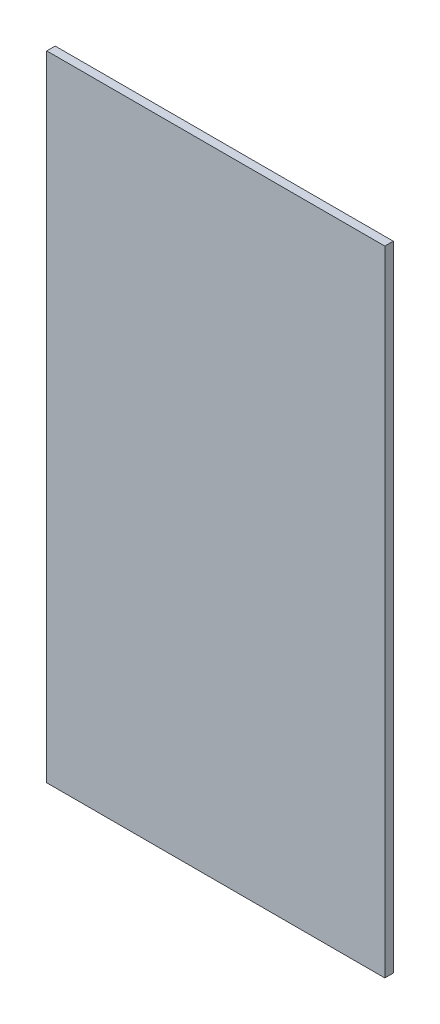
ISO-10303-21;
HEADER;
FILE_DESCRIPTION(('STEP AP214'),'2;1');
FILE_NAME('part.step','',(''),(''),'','','');
FILE_SCHEMA(('AUTOMOTIVE_DESIGN { 1 0 10303 214 1 1 1 1 }'));
ENDSEC;
DATA;
#1=APPLICATION_CONTEXT('core data for automotive mechanical design processes');
#2=APPLICATION_PROTOCOL_DEFINITION('international standard','automotive_design',2000,#1);
#3=PRODUCT_CONTEXT('',#1,'mechanical');
#4=PRODUCT('Part','Part','',(#3));
#5=PRODUCT_RELATED_PRODUCT_CATEGORY('part','',(#4));
#6=PRODUCT_DEFINITION_FORMATION('','',#4);
#7=PRODUCT_DEFINITION_CONTEXT('part definition',#1,'design');
#8=PRODUCT_DEFINITION('design','',#6,#7);
#9=PRODUCT_DEFINITION_SHAPE('','',#8);
#10=(LENGTH_UNIT() NAMED_UNIT(*) SI_UNIT(.MILLI.,.METRE.));
#11=(NAMED_UNIT(*) PLANE_ANGLE_UNIT() SI_UNIT($,.RADIAN.));
#12=(NAMED_UNIT(*) SI_UNIT($,.STERADIAN.) SOLID_ANGLE_UNIT());
#13=UNCERTAINTY_MEASURE_WITH_UNIT(LENGTH_MEASURE(1.E-05),#10,'distance_accuracy_value','');
#14=(GEOMETRIC_REPRESENTATION_CONTEXT(3) GLOBAL_UNCERTAINTY_ASSIGNED_CONTEXT((#13)) GLOBAL_UNIT_ASSIGNED_CONTEXT((#10,
#11,#12)) REPRESENTATION_CONTEXT('',''));
#15=CARTESIAN_POINT('',(0.,0.,0.));
#16=DIRECTION('',(0.,0.,1.));
#17=DIRECTION('',(1.,0.,0.));
#18=AXIS2_PLACEMENT_3D('',#15,#16,#17);
#19=CARTESIAN_POINT('',(0.,0.,10.));
#20=DIRECTION('',(1.,0.,0.));
#21=DIRECTION('',(0.,0.,-1.));
#22=AXIS2_PLACEMENT_3D('',#19,#20,#21);
#23=PLANE('',#22);
#24=DIRECTION('',(0.,-1.,0.));
#25=VECTOR('',#24,1.);
#26=CARTESIAN_POINT('',(0.,0.,0.));
#27=LINE('',#26,#25);
#28=CARTESIAN_POINT('',(0.,0.,0.));
#29=VERTEX_POINT('',#28);
#30=CARTESIAN_POINT('',(0.,-750.,0.));
#31=VERTEX_POINT('',#30);
#32=EDGE_CURVE('E110',#29,#31,#27,.T.);
#33=ORIENTED_EDGE('',*,*,#32,.T.);
#34=DIRECTION('',(0.,0.,-1.));
#35=VECTOR('',#34,1.);
#36=CARTESIAN_POINT('',(0.,-750.,10.));
#37=LINE('',#36,#35);
#38=CARTESIAN_POINT('',(0.,-750.,10.));
#39=VERTEX_POINT('',#38);
#40=EDGE_CURVE('E11',#39,#31,#37,.T.);
#41=ORIENTED_EDGE('',*,*,#40,.F.);
#42=DIRECTION('',(0.,-1.,0.));
#43=VECTOR('',#42,1.);
#44=CARTESIAN_POINT('',(0.,0.,10.));
#45=LINE('',#44,#43);
#46=CARTESIAN_POINT('',(0.,0.,10.));
#47=VERTEX_POINT('',#46);
#48=EDGE_CURVE('E94',#47,#39,#45,.T.);
#49=ORIENTED_EDGE('',*,*,#48,.F.);
#50=DIRECTION('',(0.,0.,-1.));
#51=VECTOR('',#50,1.);
#52=CARTESIAN_POINT('',(0.,0.,10.));
#53=LINE('',#52,#51);
#54=EDGE_CURVE('E106',#47,#29,#53,.T.);
#55=ORIENTED_EDGE('',*,*,#54,.T.);
#56=EDGE_LOOP('',(#33,#41,#49,#55));
#57=FACE_BOUND('',#56,.T.);
#58=ADVANCED_FACE('F42',(#57),#23,.F.);
#59=CARTESIAN_POINT('',(0.,-750.,10.));
#60=DIRECTION('',(0.,1.,0.));
#61=DIRECTION('',(0.,0.,1.));
#62=AXIS2_PLACEMENT_3D('',#59,#60,#61);
#63=PLANE('',#62);
#64=DIRECTION('',(1.,0.,0.));
#65=VECTOR('',#64,1.);
#66=CARTESIAN_POINT('',(0.,-750.,0.));
#67=LINE('',#66,#65);
#68=CARTESIAN_POINT('',(400.,-750.,0.));
#69=VERTEX_POINT('',#68);
#70=EDGE_CURVE('E99',#31,#69,#67,.T.);
#71=ORIENTED_EDGE('',*,*,#70,.T.);
#72=DIRECTION('',(0.,0.,-1.));
#73=VECTOR('',#72,1.);
#74=CARTESIAN_POINT('',(400.,-750.,10.));
#75=LINE('',#74,#73);
#76=CARTESIAN_POINT('',(400.,-750.,10.));
#77=VERTEX_POINT('',#76);
#78=EDGE_CURVE('E51',#77,#69,#75,.T.);
#79=ORIENTED_EDGE('',*,*,#78,.F.);
#80=DIRECTION('',(1.,0.,0.));
#81=VECTOR('',#80,1.);
#82=CARTESIAN_POINT('',(0.,-750.,10.));
#83=LINE('',#82,#81);
#84=EDGE_CURVE('E89',#39,#77,#83,.T.);
#85=ORIENTED_EDGE('',*,*,#84,.F.);
#86=ORIENTED_EDGE('',*,*,#40,.T.);
#87=EDGE_LOOP('',(#71,#79,#85,#86));
#88=FACE_BOUND('',#87,.T.);
#89=ADVANCED_FACE('F98',(#88),#63,.F.);
#90=CARTESIAN_POINT('',(400.,0.,10.));
#91=DIRECTION('',(-1.,0.,0.));
#92=DIRECTION('',(0.,-1.,0.));
#93=AXIS2_PLACEMENT_3D('',#90,#91,#92);
#94=PLANE('',#93);
#95=DIRECTION('',(0.,1.,0.));
#96=VECTOR('',#95,1.);
#97=CARTESIAN_POINT('',(400.,0.,0.));
#98=LINE('',#97,#96);
#99=CARTESIAN_POINT('',(400.,0.,0.));
#100=VERTEX_POINT('',#99);
#101=EDGE_CURVE('E76',#69,#100,#98,.T.);
#102=ORIENTED_EDGE('',*,*,#101,.T.);
#103=DIRECTION('',(0.,0.,-1.));
#104=VECTOR('',#103,1.);
#105=CARTESIAN_POINT('',(400.,0.,10.));
#106=LINE('',#105,#104);
#107=CARTESIAN_POINT('',(400.,0.,10.));
#108=VERTEX_POINT('',#107);
#109=EDGE_CURVE('E101',#108,#100,#106,.T.);
#110=ORIENTED_EDGE('',*,*,#109,.F.);
#111=DIRECTION('',(0.,1.,0.));
#112=VECTOR('',#111,1.);
#113=CARTESIAN_POINT('',(400.,0.,10.));
#114=LINE('',#113,#112);
#115=EDGE_CURVE('E92',#77,#108,#114,.T.);
#116=ORIENTED_EDGE('',*,*,#115,.F.);
#117=ORIENTED_EDGE('',*,*,#78,.T.);
#118=EDGE_LOOP('',(#102,#110,#116,#117));
#119=FACE_BOUND('',#118,.T.);
#120=ADVANCED_FACE('F102',(#119),#94,.F.);
#121=CARTESIAN_POINT('',(0.,0.,10.));
#122=DIRECTION('',(0.,-1.,0.));
#123=DIRECTION('',(0.,0.,-1.));
#124=AXIS2_PLACEMENT_3D('',#121,#122,#123);
#125=PLANE('',#124);
#126=DIRECTION('',(-1.,0.,0.));
#127=VECTOR('',#126,1.);
#128=CARTESIAN_POINT('',(0.,0.,0.));
#129=LINE('',#128,#127);
#130=EDGE_CURVE('E82',#100,#29,#129,.T.);
#131=ORIENTED_EDGE('',*,*,#130,.T.);
#132=ORIENTED_EDGE('',*,*,#54,.F.);
#133=DIRECTION('',(-1.,0.,0.));
#134=VECTOR('',#133,1.);
#135=CARTESIAN_POINT('',(0.,0.,10.));
#136=LINE('',#135,#134);
#137=EDGE_CURVE('E59',#108,#47,#136,.T.);
#138=ORIENTED_EDGE('',*,*,#137,.F.);
#139=ORIENTED_EDGE('',*,*,#109,.T.);
#140=EDGE_LOOP('',(#131,#132,#138,#139));
#141=FACE_BOUND('',#140,.T.);
#142=ADVANCED_FACE('F123',(#141),#125,.F.);
#143=CARTESIAN_POINT('',(0.,0.,10.));
#144=DIRECTION('',(0.,0.,1.));
#145=DIRECTION('',(1.,0.,0.));
#146=AXIS2_PLACEMENT_3D('',#143,#144,#145);
#147=PLANE('',#146);
#148=ORIENTED_EDGE('',*,*,#48,.T.);
#149=ORIENTED_EDGE('',*,*,#84,.T.);
#150=ORIENTED_EDGE('',*,*,#115,.T.);
#151=ORIENTED_EDGE('',*,*,#137,.T.);
#152=EDGE_LOOP('',(#148,#149,#150,#151));
#153=FACE_BOUND('',#152,.T.);
#154=ADVANCED_FACE('F90',(#153),#147,.T.);
#155=CARTESIAN_POINT('',(0.,0.,0.));
#156=DIRECTION('',(0.,0.,1.));
#157=DIRECTION('',(1.,0.,0.));
#158=AXIS2_PLACEMENT_3D('',#155,#156,#157);
#159=PLANE('',#158);
#160=ORIENTED_EDGE('',*,*,#32,.F.);
#161=ORIENTED_EDGE('',*,*,#130,.F.);
#162=ORIENTED_EDGE('',*,*,#101,.F.);
#163=ORIENTED_EDGE('',*,*,#70,.F.);
#164=EDGE_LOOP('',(#160,#161,#162,#163));
#165=FACE_BOUND('',#164,.T.);
#166=ADVANCED_FACE('F126',(#165),#159,.F.);
#167=CLOSED_SHELL('',(#58,#89,#120,#142,#154,#166));
#168=MANIFOLD_SOLID_BREP('B2',#167);
#169=ADVANCED_BREP_SHAPE_REPRESENTATION('',(#18,#168),#14);
#170=SHAPE_DEFINITION_REPRESENTATION(#9,#169);
ENDSEC;
END-ISO-10303-21;
